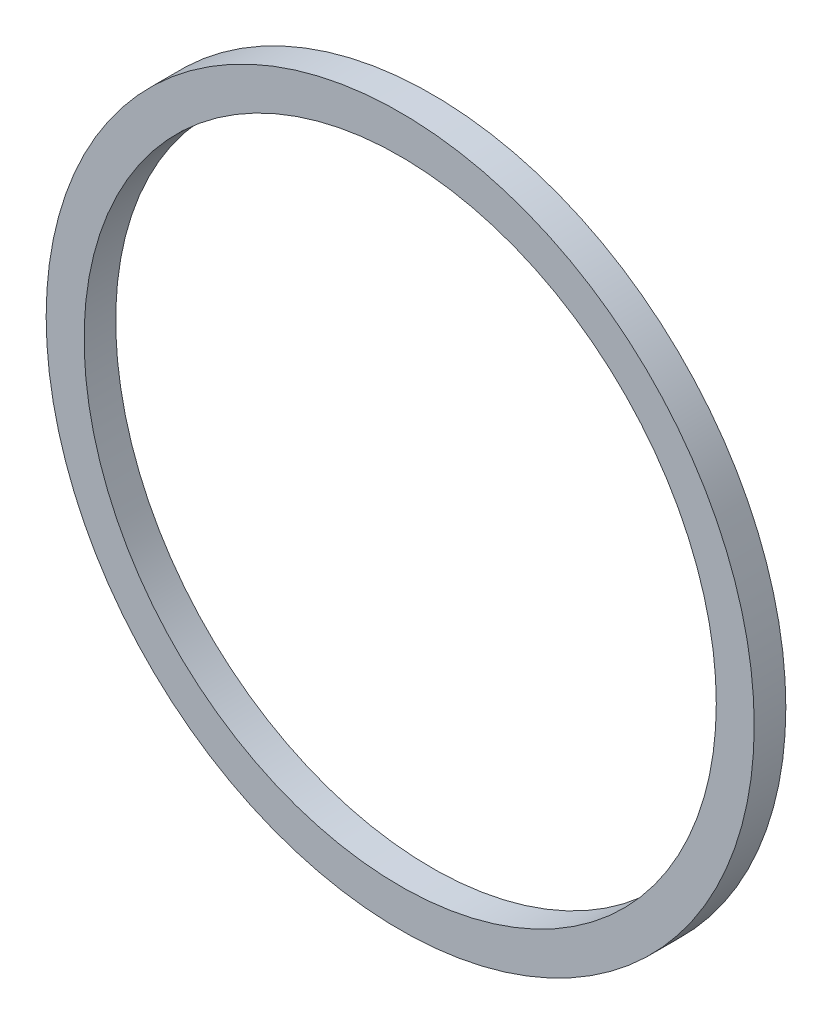
ISO-10303-21;
HEADER;
FILE_DESCRIPTION(('STEP AP214'),'2;1');
FILE_NAME('part.step','',(''),(''),'','','');
FILE_SCHEMA(('AUTOMOTIVE_DESIGN { 1 0 10303 214 1 1 1 1 }'));
ENDSEC;
DATA;
#1=APPLICATION_CONTEXT('core data for automotive mechanical design processes');
#2=APPLICATION_PROTOCOL_DEFINITION('international standard','automotive_design',2000,#1);
#3=PRODUCT_CONTEXT('',#1,'mechanical');
#4=PRODUCT('Part','Part','',(#3));
#5=PRODUCT_RELATED_PRODUCT_CATEGORY('part','',(#4));
#6=PRODUCT_DEFINITION_FORMATION('','',#4);
#7=PRODUCT_DEFINITION_CONTEXT('part definition',#1,'design');
#8=PRODUCT_DEFINITION('design','',#6,#7);
#9=PRODUCT_DEFINITION_SHAPE('','',#8);
#10=(LENGTH_UNIT() NAMED_UNIT(*) SI_UNIT(.MILLI.,.METRE.));
#11=(NAMED_UNIT(*) PLANE_ANGLE_UNIT() SI_UNIT($,.RADIAN.));
#12=(NAMED_UNIT(*) SI_UNIT($,.STERADIAN.) SOLID_ANGLE_UNIT());
#13=UNCERTAINTY_MEASURE_WITH_UNIT(LENGTH_MEASURE(1.E-05),#10,'distance_accuracy_value','');
#14=(GEOMETRIC_REPRESENTATION_CONTEXT(3) GLOBAL_UNCERTAINTY_ASSIGNED_CONTEXT((#13)) GLOBAL_UNIT_ASSIGNED_CONTEXT((#10,
#11,#12)) REPRESENTATION_CONTEXT('',''));
#15=CARTESIAN_POINT('',(0.,0.,0.));
#16=DIRECTION('',(0.,0.,1.));
#17=DIRECTION('',(1.,0.,0.));
#18=AXIS2_PLACEMENT_3D('',#15,#16,#17);
#19=CARTESIAN_POINT('',(0.,0.,1.));
#20=DIRECTION('',(0.,0.,1.));
#21=DIRECTION('',(1.,0.,0.));
#22=AXIS2_PLACEMENT_3D('',#19,#20,#21);
#23=PLANE('',#22);
#24=CARTESIAN_POINT('',(0.,0.,1.));
#25=DIRECTION('',(0.,0.,1.));
#26=DIRECTION('',(1.,0.,0.));
#27=AXIS2_PLACEMENT_3D('',#24,#25,#26);
#28=CIRCLE('',#27,11.2);
#29=CARTESIAN_POINT('',(11.2,0.,1.));
#30=VERTEX_POINT('',#29);
#31=EDGE_CURVE('E10',#30,#30,#28,.T.);
#32=ORIENTED_EDGE('',*,*,#31,.T.);
#33=EDGE_LOOP('',(#32));
#34=FACE_BOUND('',#33,.T.);
#35=CARTESIAN_POINT('',(0.,0.,1.));
#36=DIRECTION('',(0.,0.,1.));
#37=DIRECTION('',(1.,0.,0.));
#38=AXIS2_PLACEMENT_3D('',#35,#36,#37);
#39=CIRCLE('',#38,10.);
#40=CARTESIAN_POINT('',(10.,0.,1.));
#41=VERTEX_POINT('',#40);
#42=EDGE_CURVE('E50',#41,#41,#39,.T.);
#43=ORIENTED_EDGE('',*,*,#42,.F.);
#44=EDGE_LOOP('',(#43));
#45=FACE_BOUND('',#44,.T.);
#46=ADVANCED_FACE('F37',(#34,#45),#23,.T.);
#47=CARTESIAN_POINT('',(0.,0.,0.));
#48=DIRECTION('',(0.,0.,1.));
#49=DIRECTION('',(1.,0.,0.));
#50=AXIS2_PLACEMENT_3D('',#47,#48,#49);
#51=PLANE('',#50);
#52=CARTESIAN_POINT('',(0.,0.,0.));
#53=DIRECTION('',(0.,0.,1.));
#54=DIRECTION('',(1.,0.,0.));
#55=AXIS2_PLACEMENT_3D('',#52,#53,#54);
#56=CIRCLE('',#55,11.2);
#57=CARTESIAN_POINT('',(11.2,0.,0.));
#58=VERTEX_POINT('',#57);
#59=EDGE_CURVE('E41',#58,#58,#56,.T.);
#60=ORIENTED_EDGE('',*,*,#59,.F.);
#61=EDGE_LOOP('',(#60));
#62=FACE_BOUND('',#61,.T.);
#63=CARTESIAN_POINT('',(0.,0.,0.));
#64=DIRECTION('',(0.,0.,1.));
#65=DIRECTION('',(1.,0.,0.));
#66=AXIS2_PLACEMENT_3D('',#63,#64,#65);
#67=CIRCLE('',#66,10.);
#68=CARTESIAN_POINT('',(10.,0.,0.));
#69=VERTEX_POINT('',#68);
#70=EDGE_CURVE('E52',#69,#69,#67,.T.);
#71=ORIENTED_EDGE('',*,*,#70,.T.);
#72=EDGE_LOOP('',(#71));
#73=FACE_BOUND('',#72,.T.);
#74=ADVANCED_FACE('F64',(#62,#73),#51,.F.);
#75=CARTESIAN_POINT('',(0.,0.,1.));
#76=DIRECTION('',(0.,0.,-1.));
#77=DIRECTION('',(-1.,0.,0.));
#78=AXIS2_PLACEMENT_3D('',#75,#76,#77);
#79=CYLINDRICAL_SURFACE('',#78,11.2);
#80=ORIENTED_EDGE('',*,*,#31,.F.);
#81=EDGE_LOOP('',(#80));
#82=FACE_BOUND('',#81,.T.);
#83=ORIENTED_EDGE('',*,*,#59,.T.);
#84=EDGE_LOOP('',(#83));
#85=FACE_BOUND('',#84,.T.);
#86=ADVANCED_FACE('F39',(#82,#85),#79,.T.);
#87=CARTESIAN_POINT('',(0.,0.,1.));
#88=DIRECTION('',(0.,0.,-1.));
#89=DIRECTION('',(-1.,0.,0.));
#90=AXIS2_PLACEMENT_3D('',#87,#88,#89);
#91=CYLINDRICAL_SURFACE('',#90,10.);
#92=ORIENTED_EDGE('',*,*,#42,.T.);
#93=EDGE_LOOP('',(#92));
#94=FACE_BOUND('',#93,.T.);
#95=ORIENTED_EDGE('',*,*,#70,.F.);
#96=EDGE_LOOP('',(#95));
#97=FACE_BOUND('',#96,.T.);
#98=ADVANCED_FACE('F60',(#94,#97),#91,.F.);
#99=CLOSED_SHELL('',(#46,#74,#86,#98));
#100=MANIFOLD_SOLID_BREP('B2',#99);
#101=ADVANCED_BREP_SHAPE_REPRESENTATION('',(#18,#100),#14);
#102=SHAPE_DEFINITION_REPRESENTATION(#9,#101);
ENDSEC;
END-ISO-10303-21;
